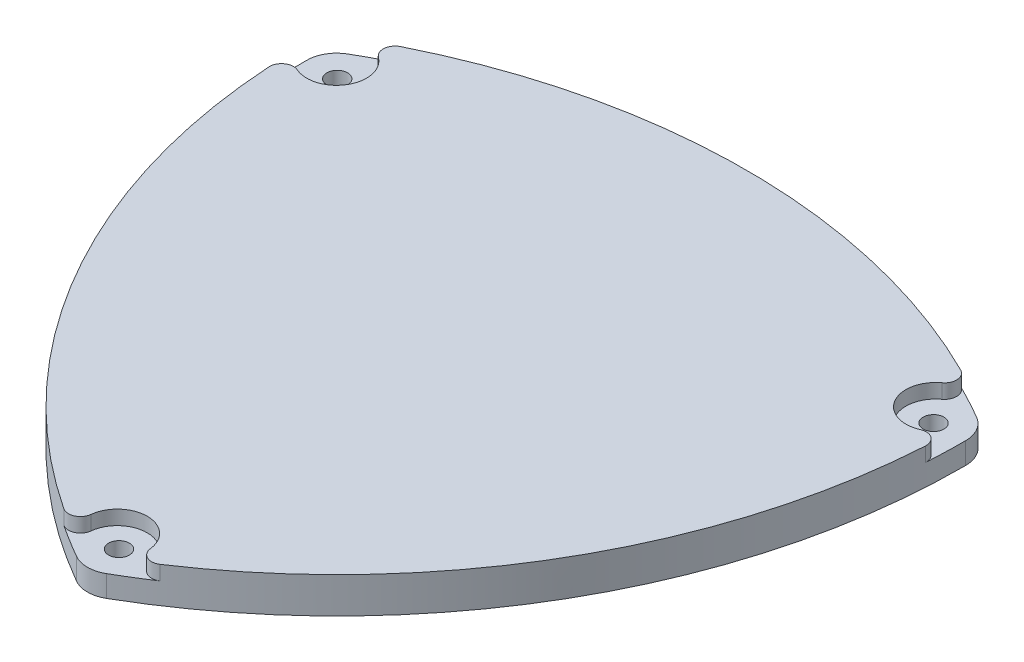
ISO-10303-21;
HEADER;
FILE_DESCRIPTION(('STEP AP214'),'2;1');
FILE_NAME('part.step','',(''),(''),'','','');
FILE_SCHEMA(('AUTOMOTIVE_DESIGN { 1 0 10303 214 1 1 1 1 }'));
ENDSEC;
DATA;
#1=APPLICATION_CONTEXT('core data for automotive mechanical design processes');
#2=APPLICATION_PROTOCOL_DEFINITION('international standard','automotive_design',2000,#1);
#3=PRODUCT_CONTEXT('',#1,'mechanical');
#4=PRODUCT('Part','Part','',(#3));
#5=PRODUCT_RELATED_PRODUCT_CATEGORY('part','',(#4));
#6=PRODUCT_DEFINITION_FORMATION('','',#4);
#7=PRODUCT_DEFINITION_CONTEXT('part definition',#1,'design');
#8=PRODUCT_DEFINITION('design','',#6,#7);
#9=PRODUCT_DEFINITION_SHAPE('','',#8);
#10=(LENGTH_UNIT() NAMED_UNIT(*) SI_UNIT(.MILLI.,.METRE.));
#11=(NAMED_UNIT(*) PLANE_ANGLE_UNIT() SI_UNIT($,.RADIAN.));
#12=(NAMED_UNIT(*) SI_UNIT($,.STERADIAN.) SOLID_ANGLE_UNIT());
#13=UNCERTAINTY_MEASURE_WITH_UNIT(LENGTH_MEASURE(1.E-05),#10,'distance_accuracy_value','');
#14=(GEOMETRIC_REPRESENTATION_CONTEXT(3) GLOBAL_UNCERTAINTY_ASSIGNED_CONTEXT((#13)) GLOBAL_UNIT_ASSIGNED_CONTEXT((#10,
#11,#12)) REPRESENTATION_CONTEXT('',''));
#15=CARTESIAN_POINT('',(0.,0.,0.));
#16=DIRECTION('',(0.,0.,1.));
#17=DIRECTION('',(1.,0.,0.));
#18=AXIS2_PLACEMENT_3D('',#15,#16,#17);
#19=CARTESIAN_POINT('',(-125.292114129072,15.,-72.3374358197575));
#20=DIRECTION('',(0.,-1.,0.));
#21=DIRECTION('',(0.,0.,-1.));
#22=AXIS2_PLACEMENT_3D('',#19,#20,#21);
#23=CYLINDRICAL_SURFACE('',#22,12.5);
#24=CARTESIAN_POINT('',(-125.292114129072,9.,-72.3374358197575));
#25=DIRECTION('',(0.,1.,0.));
#26=DIRECTION('',(0.,0.,1.));
#27=AXIS2_PLACEMENT_3D('',#24,#25,#26);
#28=CIRCLE('',#27,12.5000000000004);
#29=CARTESIAN_POINT('',(-131.556719835525,9.,-83.1543076107457));
#30=VERTEX_POINT('',#29);
#31=CARTESIAN_POINT('',(-137.792102742774,9.,-72.3543076107454));
#32=VERTEX_POINT('',#31);
#33=EDGE_CURVE('E173',#30,#32,#28,.T.);
#34=ORIENTED_EDGE('',*,*,#33,.F.);
#35=DIRECTION('',(0.,-1.,0.));
#36=VECTOR('',#35,1.);
#37=CARTESIAN_POINT('',(-131.556719835525,15.,-83.154307610746));
#38=LINE('',#37,#36);
#39=CARTESIAN_POINT('',(-131.556719835525,0.,-83.154307610746));
#40=VERTEX_POINT('',#39);
#41=EDGE_CURVE('E286',#30,#40,#38,.T.);
#42=ORIENTED_EDGE('',*,*,#41,.T.);
#43=CARTESIAN_POINT('',(-125.292114129072,0.,-72.3374358197575));
#44=DIRECTION('',(0.,1.,0.));
#45=DIRECTION('',(0.,0.,-1.));
#46=AXIS2_PLACEMENT_3D('',#43,#44,#45);
#47=CIRCLE('',#46,12.5);
#48=CARTESIAN_POINT('',(-137.792102742773,0.,-72.3543076107455));
#49=VERTEX_POINT('',#48);
#50=EDGE_CURVE('E184',#40,#49,#47,.T.);
#51=ORIENTED_EDGE('',*,*,#50,.T.);
#52=DIRECTION('',(0.,-1.,0.));
#53=VECTOR('',#52,1.);
#54=CARTESIAN_POINT('',(-137.792102742773,15.,-72.3543076107455));
#55=LINE('',#54,#53);
#56=EDGE_CURVE('E166',#32,#49,#55,.T.);
#57=ORIENTED_EDGE('',*,*,#56,.F.);
#58=EDGE_LOOP('',(#34,#42,#51,#57));
#59=FACE_BOUND('',#58,.T.);
#60=ADVANCED_FACE('F34',(#59),#23,.T.);
#61=CARTESIAN_POINT('',(0.,15.,144.674871639514));
#62=DIRECTION('',(0.,-1.,0.));
#63=DIRECTION('',(0.,0.,-1.));
#64=AXIS2_PLACEMENT_3D('',#61,#62,#63);
#65=CYLINDRICAL_SURFACE('',#64,12.5);
#66=CARTESIAN_POINT('',(0.,9.,144.674871639514));
#67=DIRECTION('',(0.,1.,0.));
#68=DIRECTION('',(0.,0.,1.));
#69=AXIS2_PLACEMENT_3D('',#66,#67,#68);
#70=CIRCLE('',#69,12.5);
#71=CARTESIAN_POINT('',(-6.23538290724816,9.,155.50861522149));
#72=VERTEX_POINT('',#71);
#73=CARTESIAN_POINT('',(6.23538290724791,9.,155.50861522149));
#74=VERTEX_POINT('',#73);
#75=EDGE_CURVE('E268',#72,#74,#70,.T.);
#76=ORIENTED_EDGE('',*,*,#75,.F.);
#77=DIRECTION('',(0.,-1.,0.));
#78=VECTOR('',#77,1.);
#79=CARTESIAN_POINT('',(-6.23538290724814,15.,155.50861522149));
#80=LINE('',#79,#78);
#81=CARTESIAN_POINT('',(-6.23538290724814,0.,155.50861522149));
#82=VERTEX_POINT('',#81);
#83=EDGE_CURVE('E186',#72,#82,#80,.T.);
#84=ORIENTED_EDGE('',*,*,#83,.T.);
#85=CARTESIAN_POINT('',(0.,0.,144.674871639514));
#86=DIRECTION('',(0.,1.,0.));
#87=DIRECTION('',(0.,0.,-1.));
#88=AXIS2_PLACEMENT_3D('',#85,#86,#87);
#89=CIRCLE('',#88,12.5);
#90=CARTESIAN_POINT('',(6.23538290724791,0.,155.50861522149));
#91=VERTEX_POINT('',#90);
#92=EDGE_CURVE('E297',#82,#91,#89,.T.);
#93=ORIENTED_EDGE('',*,*,#92,.T.);
#94=DIRECTION('',(0.,-1.,0.));
#95=VECTOR('',#94,1.);
#96=CARTESIAN_POINT('',(6.23538290724791,15.,155.50861522149));
#97=LINE('',#96,#95);
#98=EDGE_CURVE('E190',#74,#91,#97,.T.);
#99=ORIENTED_EDGE('',*,*,#98,.F.);
#100=EDGE_LOOP('',(#76,#84,#93,#99));
#101=FACE_BOUND('',#100,.T.);
#102=ADVANCED_FACE('F318',(#101),#65,.T.);
#103=CARTESIAN_POINT('',(125.292114129073,15.,-72.3374358197584));
#104=DIRECTION('',(0.,-1.,0.));
#105=DIRECTION('',(0.,0.,-1.));
#106=AXIS2_PLACEMENT_3D('',#103,#104,#105);
#107=CYLINDRICAL_SURFACE('',#106,12.5);
#108=CARTESIAN_POINT('',(125.292114129073,9.,-72.3374358197584));
#109=DIRECTION('',(0.,1.,0.));
#110=DIRECTION('',(0.,0.,1.));
#111=AXIS2_PLACEMENT_3D('',#108,#109,#110);
#112=CIRCLE('',#111,12.5);
#113=CARTESIAN_POINT('',(137.792102742774,9.,-72.3543076107463));
#114=VERTEX_POINT('',#113);
#115=CARTESIAN_POINT('',(131.556719835526,9.,-83.1543076107462));
#116=VERTEX_POINT('',#115);
#117=EDGE_CURVE('E327',#114,#116,#112,.T.);
#118=ORIENTED_EDGE('',*,*,#117,.F.);
#119=DIRECTION('',(0.,-1.,0.));
#120=VECTOR('',#119,1.);
#121=CARTESIAN_POINT('',(137.792102742774,15.,-72.3543076107463));
#122=LINE('',#121,#120);
#123=CARTESIAN_POINT('',(137.792102742774,0.,-72.3543076107463));
#124=VERTEX_POINT('',#123);
#125=EDGE_CURVE('E311',#114,#124,#122,.T.);
#126=ORIENTED_EDGE('',*,*,#125,.T.);
#127=CARTESIAN_POINT('',(125.292114129073,0.,-72.3374358197584));
#128=DIRECTION('',(0.,1.,0.));
#129=DIRECTION('',(0.,0.,1.));
#130=AXIS2_PLACEMENT_3D('',#127,#128,#129);
#131=CIRCLE('',#130,12.5);
#132=CARTESIAN_POINT('',(131.556719835526,0.,-83.1543076107462));
#133=VERTEX_POINT('',#132);
#134=EDGE_CURVE('E303',#124,#133,#131,.T.);
#135=ORIENTED_EDGE('',*,*,#134,.T.);
#136=DIRECTION('',(0.,-1.,0.));
#137=VECTOR('',#136,1.);
#138=CARTESIAN_POINT('',(131.556719835526,15.,-83.1543076107462));
#139=LINE('',#138,#137);
#140=EDGE_CURVE('E309',#116,#133,#139,.T.);
#141=ORIENTED_EDGE('',*,*,#140,.F.);
#142=EDGE_LOOP('',(#118,#126,#135,#141));
#143=FACE_BOUND('',#142,.T.);
#144=ADVANCED_FACE('F326',(#143),#107,.T.);
#145=CARTESIAN_POINT('',(0.,15.,144.));
#146=DIRECTION('',(0.,-1.,0.));
#147=DIRECTION('',(0.,0.,-1.));
#148=AXIS2_PLACEMENT_3D('',#145,#146,#147);
#149=CYLINDRICAL_SURFACE('',#148,4.35);
#150=CARTESIAN_POINT('',(0.,0.,144.));
#151=DIRECTION('',(0.,1.,0.));
#152=DIRECTION('',(0.,0.,1.));
#153=AXIS2_PLACEMENT_3D('',#150,#151,#152);
#154=CIRCLE('',#153,4.35);
#155=CARTESIAN_POINT('',(0.,0.,148.35));
#156=VERTEX_POINT('',#155);
#157=EDGE_CURVE('E295',#156,#156,#154,.T.);
#158=ORIENTED_EDGE('',*,*,#157,.F.);
#159=EDGE_LOOP('',(#158));
#160=FACE_BOUND('',#159,.T.);
#161=CARTESIAN_POINT('',(0.,9.,144.));
#162=DIRECTION('',(0.,1.,0.));
#163=DIRECTION('',(0.,0.,1.));
#164=AXIS2_PLACEMENT_3D('',#161,#162,#163);
#165=CIRCLE('',#164,4.35);
#166=CARTESIAN_POINT('',(0.,9.,148.35));
#167=VERTEX_POINT('',#166);
#168=EDGE_CURVE('E199',#167,#167,#165,.T.);
#169=ORIENTED_EDGE('',*,*,#168,.T.);
#170=EDGE_LOOP('',(#169));
#171=FACE_BOUND('',#170,.T.);
#172=ADVANCED_FACE('F353',(#160,#171),#149,.F.);
#173=CARTESIAN_POINT('',(-124.707658144959,15.,-72.0000000000004));
#174=DIRECTION('',(0.,-1.,0.));
#175=DIRECTION('',(0.,0.,-1.));
#176=AXIS2_PLACEMENT_3D('',#173,#174,#175);
#177=CYLINDRICAL_SURFACE('',#176,4.3499999999993);
#178=CARTESIAN_POINT('',(-124.707658144959,0.,-72.0000000000004));
#179=DIRECTION('',(0.,1.,0.));
#180=DIRECTION('',(0.,0.,1.));
#181=AXIS2_PLACEMENT_3D('',#178,#179,#180);
#182=CIRCLE('',#181,4.3499999999993);
#183=CARTESIAN_POINT('',(-124.707658144959,0.,-67.6500000000011));
#184=VERTEX_POINT('',#183);
#185=EDGE_CURVE('E347',#184,#184,#182,.T.);
#186=ORIENTED_EDGE('',*,*,#185,.F.);
#187=EDGE_LOOP('',(#186));
#188=FACE_BOUND('',#187,.T.);
#189=CARTESIAN_POINT('',(-124.707658144959,9.,-72.0000000000004));
#190=DIRECTION('',(0.,1.,0.));
#191=DIRECTION('',(0.,0.,1.));
#192=AXIS2_PLACEMENT_3D('',#189,#190,#191);
#193=CIRCLE('',#192,4.3499999999993);
#194=CARTESIAN_POINT('',(-124.707658144959,9.,-67.6500000000011));
#195=VERTEX_POINT('',#194);
#196=EDGE_CURVE('E196',#195,#195,#193,.T.);
#197=ORIENTED_EDGE('',*,*,#196,.T.);
#198=EDGE_LOOP('',(#197));
#199=FACE_BOUND('',#198,.T.);
#200=ADVANCED_FACE('F356',(#188,#199),#177,.F.);
#201=CARTESIAN_POINT('',(124.70765814496,15.,-71.9999999999997));
#202=DIRECTION('',(0.,-1.,0.));
#203=DIRECTION('',(0.,0.,-1.));
#204=AXIS2_PLACEMENT_3D('',#201,#202,#203);
#205=CYLINDRICAL_SURFACE('',#204,4.3499999999995);
#206=CARTESIAN_POINT('',(124.70765814496,0.,-71.9999999999997));
#207=DIRECTION('',(0.,1.,0.));
#208=DIRECTION('',(0.,0.,1.));
#209=AXIS2_PLACEMENT_3D('',#206,#207,#208);
#210=CIRCLE('',#209,4.3499999999995);
#211=CARTESIAN_POINT('',(124.70765814496,0.,-67.6500000000002));
#212=VERTEX_POINT('',#211);
#213=EDGE_CURVE('E201',#212,#212,#210,.T.);
#214=ORIENTED_EDGE('',*,*,#213,.F.);
#215=EDGE_LOOP('',(#214));
#216=FACE_BOUND('',#215,.T.);
#217=CARTESIAN_POINT('',(124.70765814496,9.,-71.9999999999997));
#218=DIRECTION('',(0.,1.,0.));
#219=DIRECTION('',(0.,0.,1.));
#220=AXIS2_PLACEMENT_3D('',#217,#218,#219);
#221=CIRCLE('',#220,4.3499999999995);
#222=CARTESIAN_POINT('',(124.70765814496,9.,-67.6500000000002));
#223=VERTEX_POINT('',#222);
#224=EDGE_CURVE('E179',#223,#223,#221,.T.);
#225=ORIENTED_EDGE('',*,*,#224,.T.);
#226=EDGE_LOOP('',(#225));
#227=FACE_BOUND('',#226,.T.);
#228=ADVANCED_FACE('F440',(#216,#227),#205,.F.);
#229=CARTESIAN_POINT('',(-62.6460570645358,15.,35.8312820901212));
#230=DIRECTION('',(0.,-1.,0.));
#231=DIRECTION('',(0.,0.,-1.));
#232=AXIS2_PLACEMENT_3D('',#229,#230,#231);
#233=PLANE('',#232);
#234=CARTESIAN_POINT('',(0.,15.,144.));
#235=DIRECTION('',(0.,1.,0.));
#236=DIRECTION('',(0.,0.,1.));
#237=AXIS2_PLACEMENT_3D('',#234,#235,#236);
#238=CIRCLE('',#237,262.500000000001);
#239=CARTESIAN_POINT('',(117.152410353456,15.,-90.9075621353554));
#240=VERTEX_POINT('',#239);
#241=CARTESIAN_POINT('',(-117.152410353455,15.,-90.9075621353557));
#242=VERTEX_POINT('',#241);
#243=EDGE_CURVE('E283',#240,#242,#238,.T.);
#244=ORIENTED_EDGE('',*,*,#243,.T.);
#245=CARTESIAN_POINT('',(-114.920935870532,15.,-86.4331323803966));
#246=DIRECTION('',(0.,-1.,0.));
#247=DIRECTION('',(0.,0.,-1.));
#248=AXIS2_PLACEMENT_3D('',#245,#246,#247);
#249=CIRCLE('',#248,5.);
#250=CARTESIAN_POINT('',(-117.884129658686,15.,-82.4057905059284));
#251=VERTEX_POINT('',#250);
#252=EDGE_CURVE('E223',#242,#251,#249,.F.);
#253=ORIENTED_EDGE('',*,*,#252,.T.);
#254=CARTESIAN_POINT('',(-125.292114129072,15.,-72.3374358197575));
#255=DIRECTION('',(0.,1.,0.));
#256=DIRECTION('',(0.,0.,1.));
#257=AXIS2_PLACEMENT_3D('',#254,#255,#256);
#258=CIRCLE('',#257,12.5000000000004);
#259=CARTESIAN_POINT('',(-130.307572826414,15.,-60.8877557344775));
#260=VERTEX_POINT('',#259);
#261=EDGE_CURVE('E406',#260,#251,#258,.T.);
#262=ORIENTED_EDGE('',*,*,#261,.F.);
#263=CARTESIAN_POINT('',(-132.313756305352,15.,-56.3078837003648));
#264=DIRECTION('',(0.,-1.,0.));
#265=DIRECTION('',(0.,0.,-1.));
#266=AXIS2_PLACEMENT_3D('',#263,#264,#265);
#267=CIRCLE('',#266,5.);
#268=CARTESIAN_POINT('',(-137.304463382057,15.,-56.0031824129933));
#269=VERTEX_POINT('',#268);
#270=EDGE_CURVE('E221',#260,#269,#267,.F.);
#271=ORIENTED_EDGE('',*,*,#270,.T.);
#272=CARTESIAN_POINT('',(124.70765814496,15.,-71.9999999999997));
#273=DIRECTION('',(0.,1.,0.));
#274=DIRECTION('',(0.,0.,1.));
#275=AXIS2_PLACEMENT_3D('',#272,#273,#274);
#276=CIRCLE('',#275,262.5);
#277=CARTESIAN_POINT('',(-20.1520530286018,15.,146.910744548349));
#278=VERTEX_POINT('',#277);
#279=EDGE_CURVE('E284',#269,#278,#276,.T.);
#280=ORIENTED_EDGE('',*,*,#279,.T.);
#281=CARTESIAN_POINT('',(-17.3928204348197,15.,142.741016080761));
#282=DIRECTION('',(0.,-1.,0.));
#283=DIRECTION('',(0.,0.,-1.));
#284=AXIS2_PLACEMENT_3D('',#281,#282,#283);
#285=CIRCLE('',#284,5.);
#286=CARTESIAN_POINT('',(-12.4234431677284,15.,143.293546240405));
#287=VERTEX_POINT('',#286);
#288=EDGE_CURVE('E213',#278,#287,#285,.F.);
#289=ORIENTED_EDGE('',*,*,#288,.T.);
#290=CARTESIAN_POINT('',(0.,15.,144.674871639514));
#291=DIRECTION('',(0.,1.,0.));
#292=DIRECTION('',(0.,0.,1.));
#293=AXIS2_PLACEMENT_3D('',#290,#291,#292);
#294=CIRCLE('',#293,12.5);
#295=CARTESIAN_POINT('',(12.4234431677283,15.,143.293546240405));
#296=VERTEX_POINT('',#295);
#297=EDGE_CURVE('E279',#296,#287,#294,.T.);
#298=ORIENTED_EDGE('',*,*,#297,.F.);
#299=CARTESIAN_POINT('',(17.3928204348197,15.,142.741016080761));
#300=DIRECTION('',(0.,-1.,0.));
#301=DIRECTION('',(0.,0.,-1.));
#302=AXIS2_PLACEMENT_3D('',#299,#300,#301);
#303=CIRCLE('',#302,5.);
#304=CARTESIAN_POINT('',(20.1520530286018,15.,146.910744548349));
#305=VERTEX_POINT('',#304);
#306=EDGE_CURVE('E215',#296,#305,#303,.F.);
#307=ORIENTED_EDGE('',*,*,#306,.T.);
#308=CARTESIAN_POINT('',(-124.707658144959,15.,-72.0000000000004));
#309=DIRECTION('',(0.,1.,0.));
#310=DIRECTION('',(0.,0.,1.));
#311=AXIS2_PLACEMENT_3D('',#308,#309,#310);
#312=CIRCLE('',#311,262.5);
#313=CARTESIAN_POINT('',(137.304463382058,15.,-56.0031824129955));
#314=VERTEX_POINT('',#313);
#315=EDGE_CURVE('E277',#305,#314,#312,.T.);
#316=ORIENTED_EDGE('',*,*,#315,.T.);
#317=CARTESIAN_POINT('',(132.313756305353,15.,-56.307883700367));
#318=DIRECTION('',(0.,-1.,0.));
#319=DIRECTION('',(0.,0.,-1.));
#320=AXIS2_PLACEMENT_3D('',#317,#318,#319);
#321=CIRCLE('',#320,5.);
#322=CARTESIAN_POINT('',(130.307572826416,15.,-60.8877557344788));
#323=VERTEX_POINT('',#322);
#324=EDGE_CURVE('E219',#314,#323,#321,.F.);
#325=ORIENTED_EDGE('',*,*,#324,.T.);
#326=CARTESIAN_POINT('',(125.292114129073,15.,-72.3374358197584));
#327=DIRECTION('',(0.,1.,0.));
#328=DIRECTION('',(0.,0.,1.));
#329=AXIS2_PLACEMENT_3D('',#326,#327,#328);
#330=CIRCLE('',#329,12.5);
#331=CARTESIAN_POINT('',(117.884129658687,15.,-82.4057905059284));
#332=VERTEX_POINT('',#331);
#333=EDGE_CURVE('E267',#332,#323,#330,.T.);
#334=ORIENTED_EDGE('',*,*,#333,.F.);
#335=CARTESIAN_POINT('',(114.920935870533,15.,-86.4331323803962));
#336=DIRECTION('',(0.,-1.,0.));
#337=DIRECTION('',(0.,0.,-1.));
#338=AXIS2_PLACEMENT_3D('',#335,#336,#337);
#339=CIRCLE('',#338,5.);
#340=EDGE_CURVE('E217',#332,#240,#339,.F.);
#341=ORIENTED_EDGE('',*,*,#340,.T.);
#342=EDGE_LOOP('',(#244,#253,#262,#271,#280,#289,#298,#307,#316,#325,#334,#341));
#343=FACE_BOUND('',#342,.T.);
#344=ADVANCED_FACE('F276',(#343),#233,.F.);
#345=CARTESIAN_POINT('',(-62.6460570645358,0.,35.8312820901212));
#346=DIRECTION('',(0.,-1.,0.));
#347=DIRECTION('',(0.,0.,-1.));
#348=AXIS2_PLACEMENT_3D('',#345,#346,#347);
#349=PLANE('',#348);
#350=ORIENTED_EDGE('',*,*,#185,.T.);
#351=EDGE_LOOP('',(#350));
#352=FACE_BOUND('',#351,.T.);
#353=ORIENTED_EDGE('',*,*,#50,.F.);
#354=CARTESIAN_POINT('',(0.,0.,144.));
#355=DIRECTION('',(0.,1.,0.));
#356=DIRECTION('',(0.,0.,1.));
#357=AXIS2_PLACEMENT_3D('',#354,#355,#356);
#358=CIRCLE('',#357,262.500000000001);
#359=EDGE_CURVE('E289',#133,#40,#358,.T.);
#360=ORIENTED_EDGE('',*,*,#359,.F.);
#361=ORIENTED_EDGE('',*,*,#134,.F.);
#362=CARTESIAN_POINT('',(-124.707658144959,0.,-72.0000000000004));
#363=DIRECTION('',(0.,1.,0.));
#364=DIRECTION('',(0.,0.,1.));
#365=AXIS2_PLACEMENT_3D('',#362,#363,#364);
#366=CIRCLE('',#365,262.5);
#367=EDGE_CURVE('E300',#91,#124,#366,.T.);
#368=ORIENTED_EDGE('',*,*,#367,.F.);
#369=ORIENTED_EDGE('',*,*,#92,.F.);
#370=CARTESIAN_POINT('',(124.70765814496,0.,-71.9999999999997));
#371=DIRECTION('',(0.,1.,0.));
#372=DIRECTION('',(0.,0.,1.));
#373=AXIS2_PLACEMENT_3D('',#370,#371,#372);
#374=CIRCLE('',#373,262.5);
#375=EDGE_CURVE('E294',#49,#82,#374,.T.);
#376=ORIENTED_EDGE('',*,*,#375,.F.);
#377=EDGE_LOOP('',(#353,#360,#361,#368,#369,#376));
#378=FACE_BOUND('',#377,.T.);
#379=ORIENTED_EDGE('',*,*,#157,.T.);
#380=EDGE_LOOP('',(#379));
#381=FACE_BOUND('',#380,.T.);
#382=ORIENTED_EDGE('',*,*,#213,.T.);
#383=EDGE_LOOP('',(#382));
#384=FACE_BOUND('',#383,.T.);
#385=ADVANCED_FACE('F320',(#352,#378,#381,#384),#349,.T.);
#386=CARTESIAN_POINT('',(124.70765814496,15.,-71.9999999999997));
#387=DIRECTION('',(0.,-1.,0.));
#388=DIRECTION('',(0.,0.,-1.));
#389=AXIS2_PLACEMENT_3D('',#386,#387,#388);
#390=CYLINDRICAL_SURFACE('',#389,262.5);
#391=ORIENTED_EDGE('',*,*,#279,.F.);
#392=DIRECTION('',(0.,-1.,0.));
#393=VECTOR('',#392,1.);
#394=CARTESIAN_POINT('',(-137.304463382057,15.,-56.0031824129933));
#395=LINE('',#394,#393);
#396=CARTESIAN_POINT('',(-137.304463382057,9.,-56.0031824129933));
#397=VERTEX_POINT('',#396);
#398=EDGE_CURVE('E169',#269,#397,#395,.T.);
#399=ORIENTED_EDGE('',*,*,#398,.T.);
#400=CARTESIAN_POINT('',(124.70765814496,9.,-71.9999999999997));
#401=DIRECTION('',(0.,1.,0.));
#402=DIRECTION('',(0.,0.,1.));
#403=AXIS2_PLACEMENT_3D('',#400,#401,#402);
#404=CIRCLE('',#403,262.5);
#405=EDGE_CURVE('E160',#397,#32,#404,.F.);
#406=ORIENTED_EDGE('',*,*,#405,.T.);
#407=ORIENTED_EDGE('',*,*,#56,.T.);
#408=ORIENTED_EDGE('',*,*,#375,.T.);
#409=ORIENTED_EDGE('',*,*,#83,.F.);
#410=CARTESIAN_POINT('',(124.70765814496,9.,-71.9999999999997));
#411=DIRECTION('',(0.,1.,0.));
#412=DIRECTION('',(0.,0.,1.));
#413=AXIS2_PLACEMENT_3D('',#410,#411,#412);
#414=CIRCLE('',#413,262.5);
#415=CARTESIAN_POINT('',(-20.1520530286018,9.,146.910744548349));
#416=VERTEX_POINT('',#415);
#417=EDGE_CURVE('E48',#72,#416,#414,.F.);
#418=ORIENTED_EDGE('',*,*,#417,.T.);
#419=DIRECTION('',(0.,-1.,0.));
#420=VECTOR('',#419,1.);
#421=CARTESIAN_POINT('',(-20.1520530286018,15.,146.910744548349));
#422=LINE('',#421,#420);
#423=EDGE_CURVE('E225',#416,#278,#422,.F.);
#424=ORIENTED_EDGE('',*,*,#423,.T.);
#425=EDGE_LOOP('',(#391,#399,#406,#407,#408,#409,#418,#424));
#426=FACE_BOUND('',#425,.T.);
#427=ADVANCED_FACE('F163',(#426),#390,.T.);
#428=CARTESIAN_POINT('',(-124.707658144959,15.,-72.0000000000004));
#429=DIRECTION('',(0.,-1.,0.));
#430=DIRECTION('',(0.,0.,-1.));
#431=AXIS2_PLACEMENT_3D('',#428,#429,#430);
#432=CYLINDRICAL_SURFACE('',#431,262.5);
#433=ORIENTED_EDGE('',*,*,#125,.F.);
#434=CARTESIAN_POINT('',(-124.707658144959,9.,-72.0000000000004));
#435=DIRECTION('',(0.,1.,0.));
#436=DIRECTION('',(0.,0.,1.));
#437=AXIS2_PLACEMENT_3D('',#434,#435,#436);
#438=CIRCLE('',#437,262.5);
#439=CARTESIAN_POINT('',(137.304463382058,9.,-56.0031824129955));
#440=VERTEX_POINT('',#439);
#441=EDGE_CURVE('E56',#114,#440,#438,.F.);
#442=ORIENTED_EDGE('',*,*,#441,.T.);
#443=DIRECTION('',(0.,-1.,0.));
#444=VECTOR('',#443,1.);
#445=CARTESIAN_POINT('',(137.304463382058,15.,-56.0031824129955));
#446=LINE('',#445,#444);
#447=EDGE_CURVE('E239',#440,#314,#446,.F.);
#448=ORIENTED_EDGE('',*,*,#447,.T.);
#449=ORIENTED_EDGE('',*,*,#315,.F.);
#450=DIRECTION('',(0.,-1.,0.));
#451=VECTOR('',#450,1.);
#452=CARTESIAN_POINT('',(20.1520530286018,15.,146.910744548349));
#453=LINE('',#452,#451);
#454=CARTESIAN_POINT('',(20.1520530286017,9.,146.910744548349));
#455=VERTEX_POINT('',#454);
#456=EDGE_CURVE('E236',#305,#455,#453,.T.);
#457=ORIENTED_EDGE('',*,*,#456,.T.);
#458=CARTESIAN_POINT('',(-124.707658144959,9.,-72.0000000000004));
#459=DIRECTION('',(0.,1.,0.));
#460=DIRECTION('',(0.,0.,1.));
#461=AXIS2_PLACEMENT_3D('',#458,#459,#460);
#462=CIRCLE('',#461,262.5);
#463=EDGE_CURVE('E234',#455,#74,#462,.F.);
#464=ORIENTED_EDGE('',*,*,#463,.T.);
#465=ORIENTED_EDGE('',*,*,#98,.T.);
#466=ORIENTED_EDGE('',*,*,#367,.T.);
#467=EDGE_LOOP('',(#433,#442,#448,#449,#457,#464,#465,#466));
#468=FACE_BOUND('',#467,.T.);
#469=ADVANCED_FACE('F281',(#468),#432,.T.);
#470=CARTESIAN_POINT('',(0.,15.,144.));
#471=DIRECTION('',(0.,-1.,0.));
#472=DIRECTION('',(0.,0.,-1.));
#473=AXIS2_PLACEMENT_3D('',#470,#471,#472);
#474=CYLINDRICAL_SURFACE('',#473,262.500000000001);
#475=ORIENTED_EDGE('',*,*,#41,.F.);
#476=CARTESIAN_POINT('',(0.,9.,144.));
#477=DIRECTION('',(0.,1.,0.));
#478=DIRECTION('',(0.,0.,1.));
#479=AXIS2_PLACEMENT_3D('',#476,#477,#478);
#480=CIRCLE('',#479,262.500000000001);
#481=CARTESIAN_POINT('',(-117.152410353455,9.,-90.9075621353558));
#482=VERTEX_POINT('',#481);
#483=EDGE_CURVE('E176',#30,#482,#480,.F.);
#484=ORIENTED_EDGE('',*,*,#483,.T.);
#485=DIRECTION('',(0.,-1.,0.));
#486=VECTOR('',#485,1.);
#487=CARTESIAN_POINT('',(-117.152410353455,15.,-90.9075621353557));
#488=LINE('',#487,#486);
#489=EDGE_CURVE('E210',#482,#242,#488,.F.);
#490=ORIENTED_EDGE('',*,*,#489,.T.);
#491=ORIENTED_EDGE('',*,*,#243,.F.);
#492=DIRECTION('',(0.,-1.,0.));
#493=VECTOR('',#492,1.);
#494=CARTESIAN_POINT('',(117.152410353456,15.,-90.9075621353554));
#495=LINE('',#494,#493);
#496=CARTESIAN_POINT('',(117.152410353456,9.,-90.9075621353553));
#497=VERTEX_POINT('',#496);
#498=EDGE_CURVE('E207',#240,#497,#495,.T.);
#499=ORIENTED_EDGE('',*,*,#498,.T.);
#500=CARTESIAN_POINT('',(0.,9.,144.));
#501=DIRECTION('',(0.,1.,0.));
#502=DIRECTION('',(0.,0.,1.));
#503=AXIS2_PLACEMENT_3D('',#500,#501,#502);
#504=CIRCLE('',#503,262.500000000001);
#505=EDGE_CURVE('E205',#497,#116,#504,.F.);
#506=ORIENTED_EDGE('',*,*,#505,.T.);
#507=ORIENTED_EDGE('',*,*,#140,.T.);
#508=ORIENTED_EDGE('',*,*,#359,.T.);
#509=EDGE_LOOP('',(#475,#484,#490,#491,#499,#506,#507,#508));
#510=FACE_BOUND('',#509,.T.);
#511=ADVANCED_FACE('F412',(#510),#474,.T.);
#512=CARTESIAN_POINT('',(125.292114129073,9.,-72.3374358197584));
#513=DIRECTION('',(0.,1.,0.));
#514=DIRECTION('',(0.,0.,1.));
#515=AXIS2_PLACEMENT_3D('',#512,#513,#514);
#516=CYLINDRICAL_SURFACE('',#515,12.5);
#517=ORIENTED_EDGE('',*,*,#333,.T.);
#518=DIRECTION('',(0.,1.,0.));
#519=VECTOR('',#518,1.);
#520=CARTESIAN_POINT('',(130.307572826416,9.,-60.8877557344788));
#521=LINE('',#520,#519);
#522=CARTESIAN_POINT('',(130.307572826416,9.,-60.8877557344788));
#523=VERTEX_POINT('',#522);
#524=EDGE_CURVE('E231',#323,#523,#521,.F.);
#525=ORIENTED_EDGE('',*,*,#524,.T.);
#526=CARTESIAN_POINT('',(117.884129658687,9.,-82.4057905059284));
#527=VERTEX_POINT('',#526);
#528=EDGE_CURVE('E339',#527,#523,#112,.T.);
#529=ORIENTED_EDGE('',*,*,#528,.F.);
#530=DIRECTION('',(0.,1.,0.));
#531=VECTOR('',#530,1.);
#532=CARTESIAN_POINT('',(117.884129658687,9.,-82.4057905059284));
#533=LINE('',#532,#531);
#534=EDGE_CURVE('E229',#527,#332,#533,.T.);
#535=ORIENTED_EDGE('',*,*,#534,.T.);
#536=EDGE_LOOP('',(#517,#525,#529,#535));
#537=FACE_BOUND('',#536,.T.);
#538=ADVANCED_FACE('F335',(#537),#516,.F.);
#539=CARTESIAN_POINT('',(125.292114129073,9.,-72.3374358197584));
#540=DIRECTION('',(0.,1.,0.));
#541=DIRECTION('',(0.,0.,1.));
#542=AXIS2_PLACEMENT_3D('',#539,#540,#541);
#543=PLANE('',#542);
#544=ORIENTED_EDGE('',*,*,#224,.F.);
#545=EDGE_LOOP('',(#544));
#546=FACE_BOUND('',#545,.T.);
#547=ORIENTED_EDGE('',*,*,#117,.T.);
#548=ORIENTED_EDGE('',*,*,#505,.F.);
#549=CARTESIAN_POINT('',(114.920935870533,9.,-86.4331323803962));
#550=DIRECTION('',(0.,1.,0.));
#551=DIRECTION('',(0.,0.,1.));
#552=AXIS2_PLACEMENT_3D('',#549,#550,#551);
#553=CIRCLE('',#552,5.);
#554=EDGE_CURVE('E253',#497,#527,#553,.F.);
#555=ORIENTED_EDGE('',*,*,#554,.T.);
#556=ORIENTED_EDGE('',*,*,#528,.T.);
#557=CARTESIAN_POINT('',(132.313756305353,9.,-56.307883700367));
#558=DIRECTION('',(0.,1.,0.));
#559=DIRECTION('',(0.,0.,1.));
#560=AXIS2_PLACEMENT_3D('',#557,#558,#559);
#561=CIRCLE('',#560,5.);
#562=EDGE_CURVE('E251',#523,#440,#561,.F.);
#563=ORIENTED_EDGE('',*,*,#562,.T.);
#564=ORIENTED_EDGE('',*,*,#441,.F.);
#565=EDGE_LOOP('',(#547,#548,#555,#556,#563,#564));
#566=FACE_BOUND('',#565,.T.);
#567=ADVANCED_FACE('F408',(#546,#566),#543,.T.);
#568=CARTESIAN_POINT('',(-125.292114129072,9.,-72.3374358197575));
#569=DIRECTION('',(0.,1.,0.));
#570=DIRECTION('',(0.,0.,1.));
#571=AXIS2_PLACEMENT_3D('',#568,#569,#570);
#572=CYLINDRICAL_SURFACE('',#571,12.5000000000004);
#573=ORIENTED_EDGE('',*,*,#261,.T.);
#574=DIRECTION('',(0.,1.,0.));
#575=VECTOR('',#574,1.);
#576=CARTESIAN_POINT('',(-117.884129658686,9.,-82.4057905059284));
#577=LINE('',#576,#575);
#578=CARTESIAN_POINT('',(-117.884129658686,9.,-82.4057905059284));
#579=VERTEX_POINT('',#578);
#580=EDGE_CURVE('E188',#251,#579,#577,.F.);
#581=ORIENTED_EDGE('',*,*,#580,.T.);
#582=CARTESIAN_POINT('',(-130.307572826414,9.,-60.8877557344775));
#583=VERTEX_POINT('',#582);
#584=EDGE_CURVE('E180',#583,#579,#28,.T.);
#585=ORIENTED_EDGE('',*,*,#584,.F.);
#586=DIRECTION('',(0.,1.,0.));
#587=VECTOR('',#586,1.);
#588=CARTESIAN_POINT('',(-130.307572826414,9.,-60.8877557344775));
#589=LINE('',#588,#587);
#590=EDGE_CURVE('E185',#583,#260,#589,.T.);
#591=ORIENTED_EDGE('',*,*,#590,.T.);
#592=EDGE_LOOP('',(#573,#581,#585,#591));
#593=FACE_BOUND('',#592,.T.);
#594=ADVANCED_FACE('F404',(#593),#572,.F.);
#595=CARTESIAN_POINT('',(-125.292114129072,9.,-72.3374358197575));
#596=DIRECTION('',(0.,1.,0.));
#597=DIRECTION('',(0.,0.,1.));
#598=AXIS2_PLACEMENT_3D('',#595,#596,#597);
#599=PLANE('',#598);
#600=ORIENTED_EDGE('',*,*,#196,.F.);
#601=EDGE_LOOP('',(#600));
#602=FACE_BOUND('',#601,.T.);
#603=ORIENTED_EDGE('',*,*,#33,.T.);
#604=ORIENTED_EDGE('',*,*,#405,.F.);
#605=CARTESIAN_POINT('',(-132.313756305352,9.,-56.3078837003648));
#606=DIRECTION('',(0.,1.,0.));
#607=DIRECTION('',(0.,0.,1.));
#608=AXIS2_PLACEMENT_3D('',#605,#606,#607);
#609=CIRCLE('',#608,5.);
#610=EDGE_CURVE('E249',#397,#583,#609,.F.);
#611=ORIENTED_EDGE('',*,*,#610,.T.);
#612=ORIENTED_EDGE('',*,*,#584,.T.);
#613=CARTESIAN_POINT('',(-114.920935870532,9.,-86.4331323803966));
#614=DIRECTION('',(0.,1.,0.));
#615=DIRECTION('',(0.,0.,1.));
#616=AXIS2_PLACEMENT_3D('',#613,#614,#615);
#617=CIRCLE('',#616,5.);
#618=EDGE_CURVE('E247',#579,#482,#617,.F.);
#619=ORIENTED_EDGE('',*,*,#618,.T.);
#620=ORIENTED_EDGE('',*,*,#483,.F.);
#621=EDGE_LOOP('',(#603,#604,#611,#612,#619,#620));
#622=FACE_BOUND('',#621,.T.);
#623=ADVANCED_FACE('F174',(#602,#622),#599,.T.);
#624=CARTESIAN_POINT('',(0.,9.,144.674871639514));
#625=DIRECTION('',(0.,1.,0.));
#626=DIRECTION('',(0.,0.,1.));
#627=AXIS2_PLACEMENT_3D('',#624,#625,#626);
#628=CYLINDRICAL_SURFACE('',#627,12.5);
#629=CARTESIAN_POINT('',(12.4234431677283,9.,143.293546240405));
#630=VERTEX_POINT('',#629);
#631=CARTESIAN_POINT('',(-12.4234431677284,9.,143.293546240405));
#632=VERTEX_POINT('',#631);
#633=EDGE_CURVE('E258',#630,#632,#70,.T.);
#634=ORIENTED_EDGE('',*,*,#633,.F.);
#635=DIRECTION('',(0.,1.,0.));
#636=VECTOR('',#635,1.);
#637=CARTESIAN_POINT('',(12.4234431677283,9.,143.293546240405));
#638=LINE('',#637,#636);
#639=EDGE_CURVE('E245',#630,#296,#638,.T.);
#640=ORIENTED_EDGE('',*,*,#639,.T.);
#641=ORIENTED_EDGE('',*,*,#297,.T.);
#642=DIRECTION('',(0.,1.,0.));
#643=VECTOR('',#642,1.);
#644=CARTESIAN_POINT('',(-12.4234431677284,9.,143.293546240405));
#645=LINE('',#644,#643);
#646=EDGE_CURVE('E242',#287,#632,#645,.F.);
#647=ORIENTED_EDGE('',*,*,#646,.T.);
#648=EDGE_LOOP('',(#634,#640,#641,#647));
#649=FACE_BOUND('',#648,.T.);
#650=ADVANCED_FACE('F263',(#649),#628,.F.);
#651=CARTESIAN_POINT('',(0.,9.,144.674871639514));
#652=DIRECTION('',(0.,1.,0.));
#653=DIRECTION('',(0.,0.,1.));
#654=AXIS2_PLACEMENT_3D('',#651,#652,#653);
#655=PLANE('',#654);
#656=ORIENTED_EDGE('',*,*,#168,.F.);
#657=EDGE_LOOP('',(#656));
#658=FACE_BOUND('',#657,.T.);
#659=ORIENTED_EDGE('',*,*,#75,.T.);
#660=ORIENTED_EDGE('',*,*,#463,.F.);
#661=CARTESIAN_POINT('',(17.3928204348197,9.,142.741016080761));
#662=DIRECTION('',(0.,1.,0.));
#663=DIRECTION('',(0.,0.,1.));
#664=AXIS2_PLACEMENT_3D('',#661,#662,#663);
#665=CIRCLE('',#664,5.);
#666=EDGE_CURVE('E42',#455,#630,#665,.F.);
#667=ORIENTED_EDGE('',*,*,#666,.T.);
#668=ORIENTED_EDGE('',*,*,#633,.T.);
#669=CARTESIAN_POINT('',(-17.3928204348197,9.,142.741016080761));
#670=DIRECTION('',(0.,1.,0.));
#671=DIRECTION('',(0.,0.,1.));
#672=AXIS2_PLACEMENT_3D('',#669,#670,#671);
#673=CIRCLE('',#672,5.);
#674=EDGE_CURVE('E11',#632,#416,#673,.F.);
#675=ORIENTED_EDGE('',*,*,#674,.T.);
#676=ORIENTED_EDGE('',*,*,#417,.F.);
#677=EDGE_LOOP('',(#659,#660,#667,#668,#675,#676));
#678=FACE_BOUND('',#677,.T.);
#679=ADVANCED_FACE('F257',(#658,#678),#655,.T.);
#680=CARTESIAN_POINT('',(-114.920935870532,15.,-86.4331323803966));
#681=DIRECTION('',(0.,1.,0.));
#682=DIRECTION('',(0.,0.,1.));
#683=AXIS2_PLACEMENT_3D('',#680,#681,#682);
#684=CYLINDRICAL_SURFACE('',#683,5.);
#685=ORIENTED_EDGE('',*,*,#252,.F.);
#686=ORIENTED_EDGE('',*,*,#489,.F.);
#687=ORIENTED_EDGE('',*,*,#618,.F.);
#688=ORIENTED_EDGE('',*,*,#580,.F.);
#689=EDGE_LOOP('',(#685,#686,#687,#688));
#690=FACE_BOUND('',#689,.T.);
#691=ADVANCED_FACE('F361',(#690),#684,.T.);
#692=CARTESIAN_POINT('',(-132.313756305352,9.,-56.3078837003648));
#693=DIRECTION('',(0.,1.,0.));
#694=DIRECTION('',(0.,0.,1.));
#695=AXIS2_PLACEMENT_3D('',#692,#693,#694);
#696=CYLINDRICAL_SURFACE('',#695,5.);
#697=ORIENTED_EDGE('',*,*,#270,.F.);
#698=ORIENTED_EDGE('',*,*,#590,.F.);
#699=ORIENTED_EDGE('',*,*,#610,.F.);
#700=ORIENTED_EDGE('',*,*,#398,.F.);
#701=EDGE_LOOP('',(#697,#698,#699,#700));
#702=FACE_BOUND('',#701,.T.);
#703=ADVANCED_FACE('F367',(#702),#696,.T.);
#704=CARTESIAN_POINT('',(132.313756305353,15.,-56.307883700367));
#705=DIRECTION('',(0.,1.,0.));
#706=DIRECTION('',(0.,0.,1.));
#707=AXIS2_PLACEMENT_3D('',#704,#705,#706);
#708=CYLINDRICAL_SURFACE('',#707,5.);
#709=ORIENTED_EDGE('',*,*,#324,.F.);
#710=ORIENTED_EDGE('',*,*,#447,.F.);
#711=ORIENTED_EDGE('',*,*,#562,.F.);
#712=ORIENTED_EDGE('',*,*,#524,.F.);
#713=EDGE_LOOP('',(#709,#710,#711,#712));
#714=FACE_BOUND('',#713,.T.);
#715=ADVANCED_FACE('F329',(#714),#708,.T.);
#716=CARTESIAN_POINT('',(114.920935870533,9.,-86.4331323803962));
#717=DIRECTION('',(0.,1.,0.));
#718=DIRECTION('',(0.,0.,1.));
#719=AXIS2_PLACEMENT_3D('',#716,#717,#718);
#720=CYLINDRICAL_SURFACE('',#719,5.);
#721=ORIENTED_EDGE('',*,*,#340,.F.);
#722=ORIENTED_EDGE('',*,*,#534,.F.);
#723=ORIENTED_EDGE('',*,*,#554,.F.);
#724=ORIENTED_EDGE('',*,*,#498,.F.);
#725=EDGE_LOOP('',(#721,#722,#723,#724));
#726=FACE_BOUND('',#725,.T.);
#727=ADVANCED_FACE('F385',(#726),#720,.T.);
#728=CARTESIAN_POINT('',(17.3928204348197,9.,142.741016080761));
#729=DIRECTION('',(0.,1.,0.));
#730=DIRECTION('',(0.,0.,1.));
#731=AXIS2_PLACEMENT_3D('',#728,#729,#730);
#732=CYLINDRICAL_SURFACE('',#731,5.);
#733=ORIENTED_EDGE('',*,*,#306,.F.);
#734=ORIENTED_EDGE('',*,*,#639,.F.);
#735=ORIENTED_EDGE('',*,*,#666,.F.);
#736=ORIENTED_EDGE('',*,*,#456,.F.);
#737=EDGE_LOOP('',(#733,#734,#735,#736));
#738=FACE_BOUND('',#737,.T.);
#739=ADVANCED_FACE('F271',(#738),#732,.T.);
#740=CARTESIAN_POINT('',(-17.3928204348197,15.,142.741016080761));
#741=DIRECTION('',(0.,1.,0.));
#742=DIRECTION('',(0.,0.,1.));
#743=AXIS2_PLACEMENT_3D('',#740,#741,#742);
#744=CYLINDRICAL_SURFACE('',#743,5.);
#745=ORIENTED_EDGE('',*,*,#288,.F.);
#746=ORIENTED_EDGE('',*,*,#423,.F.);
#747=ORIENTED_EDGE('',*,*,#674,.F.);
#748=ORIENTED_EDGE('',*,*,#646,.F.);
#749=EDGE_LOOP('',(#745,#746,#747,#748));
#750=FACE_BOUND('',#749,.T.);
#751=ADVANCED_FACE('F36',(#750),#744,.T.);
#752=CLOSED_SHELL('',(#60,#102,#144,#172,#200,#228,#344,#385,#427,#469,#511,#538,#567,#594,#623,
#650,#679,#691,#703,#715,#727,#739,#751));
#753=MANIFOLD_SOLID_BREP('B2',#752);
#754=ADVANCED_BREP_SHAPE_REPRESENTATION('',(#18,#753),#14);
#755=SHAPE_DEFINITION_REPRESENTATION(#9,#754);
ENDSEC;
END-ISO-10303-21;
